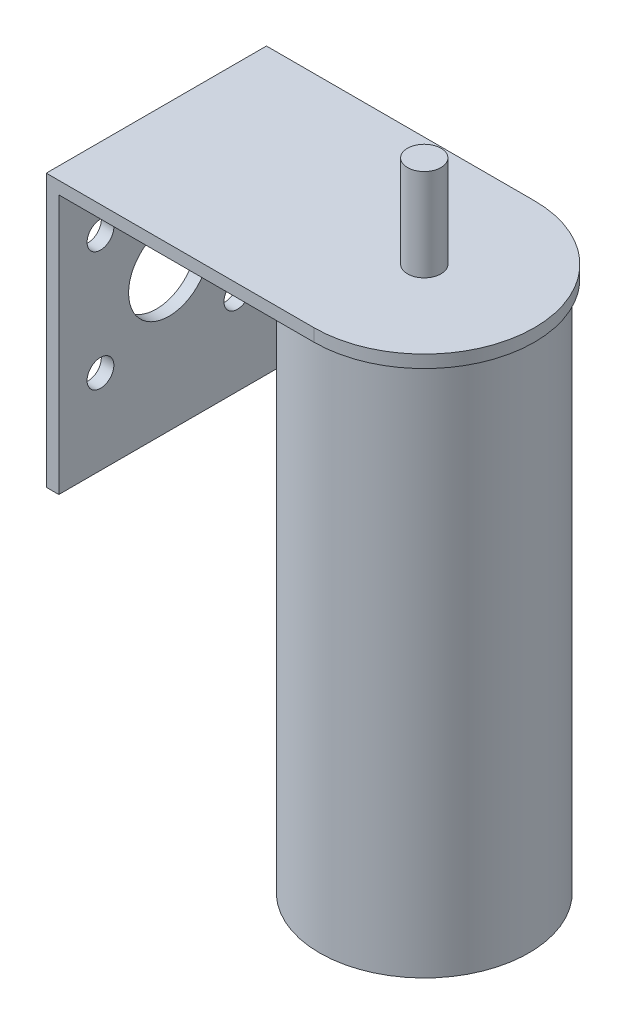
ISO-10303-21;
HEADER;
FILE_DESCRIPTION(('STEP AP214'),'2;1');
FILE_NAME('part.step','',(''),(''),'','','');
FILE_SCHEMA(('AUTOMOTIVE_DESIGN { 1 0 10303 214 1 1 1 1 }'));
ENDSEC;
DATA;
#1=APPLICATION_CONTEXT('core data for automotive mechanical design processes');
#2=APPLICATION_PROTOCOL_DEFINITION('international standard','automotive_design',2000,#1);
#3=PRODUCT_CONTEXT('',#1,'mechanical');
#4=PRODUCT('Part','Part','',(#3));
#5=PRODUCT_RELATED_PRODUCT_CATEGORY('part','',(#4));
#6=PRODUCT_DEFINITION_FORMATION('','',#4);
#7=PRODUCT_DEFINITION_CONTEXT('part definition',#1,'design');
#8=PRODUCT_DEFINITION('design','',#6,#7);
#9=PRODUCT_DEFINITION_SHAPE('','',#8);
#10=(LENGTH_UNIT() NAMED_UNIT(*) SI_UNIT(.MILLI.,.METRE.));
#11=(NAMED_UNIT(*) PLANE_ANGLE_UNIT() SI_UNIT($,.RADIAN.));
#12=(NAMED_UNIT(*) SI_UNIT($,.STERADIAN.) SOLID_ANGLE_UNIT());
#13=UNCERTAINTY_MEASURE_WITH_UNIT(LENGTH_MEASURE(1.E-05),#10,'distance_accuracy_value','');
#14=(GEOMETRIC_REPRESENTATION_CONTEXT(3) GLOBAL_UNCERTAINTY_ASSIGNED_CONTEXT((#13)) GLOBAL_UNIT_ASSIGNED_CONTEXT((#10,
#11,#12)) REPRESENTATION_CONTEXT('',''));
#15=CARTESIAN_POINT('',(0.,0.,0.));
#16=DIRECTION('',(0.,0.,1.));
#17=DIRECTION('',(1.,0.,0.));
#18=AXIS2_PLACEMENT_3D('',#15,#16,#17);
#19=CARTESIAN_POINT('',(0.,63.5,0.));
#20=DIRECTION('',(0.,-1.,0.));
#21=DIRECTION('',(0.,0.,-1.));
#22=AXIS2_PLACEMENT_3D('',#19,#20,#21);
#23=PLANE('',#22);
#24=CARTESIAN_POINT('',(0.,63.5,0.));
#25=DIRECTION('',(0.,-1.,0.));
#26=DIRECTION('',(0.,0.,-1.));
#27=AXIS2_PLACEMENT_3D('',#24,#25,#26);
#28=CIRCLE('',#27,12.5);
#29=CARTESIAN_POINT('',(0.,63.5,-12.5));
#30=VERTEX_POINT('',#29);
#31=EDGE_CURVE('E101',#30,#30,#28,.T.);
#32=ORIENTED_EDGE('',*,*,#31,.F.);
#33=EDGE_LOOP('',(#32));
#34=FACE_BOUND('',#33,.T.);
#35=DIRECTION('',(1.,0.,0.));
#36=VECTOR('',#35,1.);
#37=CARTESIAN_POINT('',(-32.,63.5,13.15));
#38=LINE('',#37,#36);
#39=CARTESIAN_POINT('',(-30.5,63.5,13.15));
#40=VERTEX_POINT('',#39);
#41=CARTESIAN_POINT('',(0.,63.5,13.15));
#42=VERTEX_POINT('',#41);
#43=EDGE_CURVE('E118',#40,#42,#38,.T.);
#44=ORIENTED_EDGE('',*,*,#43,.F.);
#45=DIRECTION('',(0.,0.,1.));
#46=VECTOR('',#45,1.);
#47=CARTESIAN_POINT('',(-30.5,63.5,13.15));
#48=LINE('',#47,#46);
#49=CARTESIAN_POINT('',(-30.5,63.5,-13.15));
#50=VERTEX_POINT('',#49);
#51=EDGE_CURVE('E151',#50,#40,#48,.T.);
#52=ORIENTED_EDGE('',*,*,#51,.F.);
#53=DIRECTION('',(-1.,0.,0.));
#54=VECTOR('',#53,1.);
#55=CARTESIAN_POINT('',(0.,63.5,-13.15));
#56=LINE('',#55,#54);
#57=CARTESIAN_POINT('',(0.,63.5,-13.15));
#58=VERTEX_POINT('',#57);
#59=EDGE_CURVE('E129',#58,#50,#56,.T.);
#60=ORIENTED_EDGE('',*,*,#59,.F.);
#61=CARTESIAN_POINT('',(0.,63.5,0.));
#62=DIRECTION('',(0.,-1.,0.));
#63=DIRECTION('',(0.,0.,-1.));
#64=AXIS2_PLACEMENT_3D('',#61,#62,#63);
#65=CIRCLE('',#64,13.15);
#66=EDGE_CURVE('E120',#58,#42,#65,.T.);
#67=ORIENTED_EDGE('',*,*,#66,.T.);
#68=EDGE_LOOP('',(#44,#52,#60,#67));
#69=FACE_BOUND('',#68,.T.);
#70=ADVANCED_FACE('F46',(#34,#69),#23,.T.);
#71=CARTESIAN_POINT('',(0.,65.,0.));
#72=DIRECTION('',(0.,1.,0.));
#73=DIRECTION('',(0.,0.,1.));
#74=AXIS2_PLACEMENT_3D('',#71,#72,#73);
#75=PLANE('',#74);
#76=CARTESIAN_POINT('',(0.,65.,0.));
#77=DIRECTION('',(0.,1.,0.));
#78=DIRECTION('',(0.,0.,1.));
#79=AXIS2_PLACEMENT_3D('',#76,#77,#78);
#80=CIRCLE('',#79,2.);
#81=CARTESIAN_POINT('',(0.,65.,2.));
#82=VERTEX_POINT('',#81);
#83=EDGE_CURVE('E13',#82,#82,#80,.T.);
#84=ORIENTED_EDGE('',*,*,#83,.F.);
#85=EDGE_LOOP('',(#84));
#86=FACE_BOUND('',#85,.T.);
#87=DIRECTION('',(0.,0.,1.));
#88=VECTOR('',#87,1.);
#89=CARTESIAN_POINT('',(-32.,65.,-13.15));
#90=LINE('',#89,#88);
#91=CARTESIAN_POINT('',(-32.,65.,-13.15));
#92=VERTEX_POINT('',#91);
#93=CARTESIAN_POINT('',(-32.,65.,13.15));
#94=VERTEX_POINT('',#93);
#95=EDGE_CURVE('E104',#92,#94,#90,.T.);
#96=ORIENTED_EDGE('',*,*,#95,.T.);
#97=DIRECTION('',(1.,0.,0.));
#98=VECTOR('',#97,1.);
#99=CARTESIAN_POINT('',(-32.,65.,13.15));
#100=LINE('',#99,#98);
#101=CARTESIAN_POINT('',(0.,65.,13.15));
#102=VERTEX_POINT('',#101);
#103=EDGE_CURVE('E111',#94,#102,#100,.T.);
#104=ORIENTED_EDGE('',*,*,#103,.T.);
#105=CARTESIAN_POINT('',(0.,65.,0.));
#106=DIRECTION('',(0.,-1.,0.));
#107=DIRECTION('',(0.,0.,-1.));
#108=AXIS2_PLACEMENT_3D('',#105,#106,#107);
#109=CIRCLE('',#108,13.15);
#110=CARTESIAN_POINT('',(0.,65.,-13.15));
#111=VERTEX_POINT('',#110);
#112=EDGE_CURVE('E117',#111,#102,#109,.T.);
#113=ORIENTED_EDGE('',*,*,#112,.F.);
#114=DIRECTION('',(-1.,0.,0.));
#115=VECTOR('',#114,1.);
#116=CARTESIAN_POINT('',(0.,65.,-13.15));
#117=LINE('',#116,#115);
#118=EDGE_CURVE('E93',#111,#92,#117,.T.);
#119=ORIENTED_EDGE('',*,*,#118,.T.);
#120=EDGE_LOOP('',(#96,#104,#113,#119));
#121=FACE_BOUND('',#120,.T.);
#122=ADVANCED_FACE('F115',(#86,#121),#75,.T.);
#123=CARTESIAN_POINT('',(0.,76.,0.));
#124=DIRECTION('',(0.,-1.,0.));
#125=DIRECTION('',(0.,0.,-1.));
#126=AXIS2_PLACEMENT_3D('',#123,#124,#125);
#127=CYLINDRICAL_SURFACE('',#126,2.);
#128=CARTESIAN_POINT('',(0.,76.,0.));
#129=DIRECTION('',(0.,1.,0.));
#130=DIRECTION('',(0.,0.,1.));
#131=AXIS2_PLACEMENT_3D('',#128,#129,#130);
#132=CIRCLE('',#131,2.);
#133=CARTESIAN_POINT('',(0.,76.,2.));
#134=VERTEX_POINT('',#133);
#135=EDGE_CURVE('E130',#134,#134,#132,.T.);
#136=ORIENTED_EDGE('',*,*,#135,.F.);
#137=EDGE_LOOP('',(#136));
#138=FACE_BOUND('',#137,.T.);
#139=ORIENTED_EDGE('',*,*,#83,.T.);
#140=EDGE_LOOP('',(#139));
#141=FACE_BOUND('',#140,.T.);
#142=ADVANCED_FACE('F238',(#138,#141),#127,.T.);
#143=CARTESIAN_POINT('',(0.,76.,0.));
#144=DIRECTION('',(0.,1.,0.));
#145=DIRECTION('',(0.,0.,1.));
#146=AXIS2_PLACEMENT_3D('',#143,#144,#145);
#147=PLANE('',#146);
#148=ORIENTED_EDGE('',*,*,#135,.T.);
#149=EDGE_LOOP('',(#148));
#150=FACE_BOUND('',#149,.T.);
#151=ADVANCED_FACE('F210',(#150),#147,.T.);
#152=CARTESIAN_POINT('',(-32.,63.5,-13.15));
#153=DIRECTION('',(-1.,0.,0.));
#154=DIRECTION('',(0.,0.,1.));
#155=AXIS2_PLACEMENT_3D('',#152,#153,#154);
#156=PLANE('',#155);
#157=CARTESIAN_POINT('',(-32.,42.6,-8.17499999999999));
#158=DIRECTION('',(-1.,0.,0.));
#159=DIRECTION('',(0.,0.,1.));
#160=AXIS2_PLACEMENT_3D('',#157,#158,#159);
#161=CIRCLE('',#160,1.59999999999999);
#162=CARTESIAN_POINT('',(-32.,42.6,-6.575));
#163=VERTEX_POINT('',#162);
#164=EDGE_CURVE('E193',#163,#163,#161,.T.);
#165=ORIENTED_EDGE('',*,*,#164,.F.);
#166=EDGE_LOOP('',(#165));
#167=FACE_BOUND('',#166,.T.);
#168=CARTESIAN_POINT('',(-32.,42.6,8.175));
#169=DIRECTION('',(-1.,0.,0.));
#170=DIRECTION('',(0.,0.,1.));
#171=AXIS2_PLACEMENT_3D('',#168,#169,#170);
#172=CIRCLE('',#171,1.6);
#173=CARTESIAN_POINT('',(-32.,42.6,9.775));
#174=VERTEX_POINT('',#173);
#175=EDGE_CURVE('E196',#174,#174,#172,.T.);
#176=ORIENTED_EDGE('',*,*,#175,.F.);
#177=EDGE_LOOP('',(#176));
#178=FACE_BOUND('',#177,.T.);
#179=CARTESIAN_POINT('',(-32.,56.9,8.17500000000001));
#180=DIRECTION('',(-1.,0.,0.));
#181=DIRECTION('',(0.,0.,1.));
#182=AXIS2_PLACEMENT_3D('',#179,#180,#181);
#183=CIRCLE('',#182,1.6);
#184=CARTESIAN_POINT('',(-32.,56.9,9.775));
#185=VERTEX_POINT('',#184);
#186=EDGE_CURVE('E199',#185,#185,#183,.T.);
#187=ORIENTED_EDGE('',*,*,#186,.F.);
#188=EDGE_LOOP('',(#187));
#189=FACE_BOUND('',#188,.T.);
#190=CARTESIAN_POINT('',(-32.,56.9,-8.175));
#191=DIRECTION('',(-1.,0.,0.));
#192=DIRECTION('',(0.,0.,1.));
#193=AXIS2_PLACEMENT_3D('',#190,#191,#192);
#194=CIRCLE('',#193,1.59999999999999);
#195=CARTESIAN_POINT('',(-32.,56.9,-6.575));
#196=VERTEX_POINT('',#195);
#197=EDGE_CURVE('E192',#196,#196,#194,.T.);
#198=ORIENTED_EDGE('',*,*,#197,.F.);
#199=EDGE_LOOP('',(#198));
#200=FACE_BOUND('',#199,.T.);
#201=CARTESIAN_POINT('',(-32.,49.1813140413089,0.));
#202=DIRECTION('',(-1.,0.,0.));
#203=DIRECTION('',(0.,0.,1.));
#204=AXIS2_PLACEMENT_3D('',#201,#202,#203);
#205=CIRCLE('',#204,4.81868595869109);
#206=CARTESIAN_POINT('',(-32.,49.1813140413089,4.8186859586911));
#207=VERTEX_POINT('',#206);
#208=EDGE_CURVE('E141',#207,#207,#205,.T.);
#209=ORIENTED_EDGE('',*,*,#208,.F.);
#210=EDGE_LOOP('',(#209));
#211=FACE_BOUND('',#210,.T.);
#212=ORIENTED_EDGE('',*,*,#95,.F.);
#213=DIRECTION('',(0.,1.,0.));
#214=VECTOR('',#213,1.);
#215=CARTESIAN_POINT('',(-32.,63.5,-13.15));
#216=LINE('',#215,#214);
#217=CARTESIAN_POINT('',(-32.,32.5,-13.15));
#218=VERTEX_POINT('',#217);
#219=EDGE_CURVE('E89',#218,#92,#216,.T.);
#220=ORIENTED_EDGE('',*,*,#219,.F.);
#221=DIRECTION('',(0.,0.,-1.));
#222=VECTOR('',#221,1.);
#223=CARTESIAN_POINT('',(-32.,32.5,13.15));
#224=LINE('',#223,#222);
#225=CARTESIAN_POINT('',(-32.,32.5,13.15));
#226=VERTEX_POINT('',#225);
#227=EDGE_CURVE('E154',#226,#218,#224,.T.);
#228=ORIENTED_EDGE('',*,*,#227,.F.);
#229=DIRECTION('',(0.,1.,0.));
#230=VECTOR('',#229,1.);
#231=CARTESIAN_POINT('',(-32.,63.5,13.15));
#232=LINE('',#231,#230);
#233=EDGE_CURVE('E107',#226,#94,#232,.T.);
#234=ORIENTED_EDGE('',*,*,#233,.T.);
#235=EDGE_LOOP('',(#212,#220,#228,#234));
#236=FACE_BOUND('',#235,.T.);
#237=ADVANCED_FACE('F105',(#167,#178,#189,#200,#211,#236),#156,.T.);
#238=CARTESIAN_POINT('',(0.,63.5,-13.15));
#239=DIRECTION('',(0.,0.,-1.));
#240=DIRECTION('',(-1.,0.,0.));
#241=AXIS2_PLACEMENT_3D('',#238,#239,#240);
#242=PLANE('',#241);
#243=ORIENTED_EDGE('',*,*,#118,.F.);
#244=DIRECTION('',(0.,1.,0.));
#245=VECTOR('',#244,1.);
#246=CARTESIAN_POINT('',(0.,63.5,-13.15));
#247=LINE('',#246,#245);
#248=EDGE_CURVE('E72',#58,#111,#247,.T.);
#249=ORIENTED_EDGE('',*,*,#248,.F.);
#250=ORIENTED_EDGE('',*,*,#59,.T.);
#251=DIRECTION('',(0.,1.,0.));
#252=VECTOR('',#251,1.);
#253=CARTESIAN_POINT('',(-30.5,32.5,-13.15));
#254=LINE('',#253,#252);
#255=CARTESIAN_POINT('',(-30.5,32.5,-13.15));
#256=VERTEX_POINT('',#255);
#257=EDGE_CURVE('E112',#256,#50,#254,.T.);
#258=ORIENTED_EDGE('',*,*,#257,.F.);
#259=DIRECTION('',(1.,0.,0.));
#260=VECTOR('',#259,1.);
#261=CARTESIAN_POINT('',(-32.,32.5,-13.15));
#262=LINE('',#261,#260);
#263=EDGE_CURVE('E97',#218,#256,#262,.T.);
#264=ORIENTED_EDGE('',*,*,#263,.F.);
#265=ORIENTED_EDGE('',*,*,#219,.T.);
#266=EDGE_LOOP('',(#243,#249,#250,#258,#264,#265));
#267=FACE_BOUND('',#266,.T.);
#268=ADVANCED_FACE('F91',(#267),#242,.T.);
#269=CARTESIAN_POINT('',(0.,63.5,0.));
#270=DIRECTION('',(0.,1.,0.));
#271=DIRECTION('',(0.,0.,1.));
#272=AXIS2_PLACEMENT_3D('',#269,#270,#271);
#273=CYLINDRICAL_SURFACE('',#272,13.15);
#274=ORIENTED_EDGE('',*,*,#112,.T.);
#275=DIRECTION('',(0.,1.,0.));
#276=VECTOR('',#275,1.);
#277=CARTESIAN_POINT('',(0.,63.5,13.15));
#278=LINE('',#277,#276);
#279=EDGE_CURVE('E126',#42,#102,#278,.T.);
#280=ORIENTED_EDGE('',*,*,#279,.F.);
#281=ORIENTED_EDGE('',*,*,#66,.F.);
#282=ORIENTED_EDGE('',*,*,#248,.T.);
#283=EDGE_LOOP('',(#274,#280,#281,#282));
#284=FACE_BOUND('',#283,.T.);
#285=ADVANCED_FACE('F173',(#284),#273,.T.);
#286=CARTESIAN_POINT('',(-32.,63.5,13.15));
#287=DIRECTION('',(0.,0.,1.));
#288=DIRECTION('',(1.,0.,0.));
#289=AXIS2_PLACEMENT_3D('',#286,#287,#288);
#290=PLANE('',#289);
#291=ORIENTED_EDGE('',*,*,#103,.F.);
#292=ORIENTED_EDGE('',*,*,#233,.F.);
#293=DIRECTION('',(-1.,0.,0.));
#294=VECTOR('',#293,1.);
#295=CARTESIAN_POINT('',(-32.,32.5,13.15));
#296=LINE('',#295,#294);
#297=CARTESIAN_POINT('',(-30.5,32.5,13.15));
#298=VERTEX_POINT('',#297);
#299=EDGE_CURVE('E163',#298,#226,#296,.T.);
#300=ORIENTED_EDGE('',*,*,#299,.F.);
#301=DIRECTION('',(0.,1.,0.));
#302=VECTOR('',#301,1.);
#303=CARTESIAN_POINT('',(-30.5,32.5,13.15));
#304=LINE('',#303,#302);
#305=EDGE_CURVE('E63',#298,#40,#304,.T.);
#306=ORIENTED_EDGE('',*,*,#305,.T.);
#307=ORIENTED_EDGE('',*,*,#43,.T.);
#308=ORIENTED_EDGE('',*,*,#279,.T.);
#309=EDGE_LOOP('',(#291,#292,#300,#306,#307,#308));
#310=FACE_BOUND('',#309,.T.);
#311=ADVANCED_FACE('F169',(#310),#290,.T.);
#312=CARTESIAN_POINT('',(0.,0.,0.));
#313=DIRECTION('',(0.,1.,0.));
#314=DIRECTION('',(0.,0.,1.));
#315=AXIS2_PLACEMENT_3D('',#312,#313,#314);
#316=PLANE('',#315);
#317=CARTESIAN_POINT('',(0.,0.,0.));
#318=DIRECTION('',(0.,1.,0.));
#319=DIRECTION('',(0.,0.,1.));
#320=AXIS2_PLACEMENT_3D('',#317,#318,#319);
#321=CIRCLE('',#320,12.5);
#322=CARTESIAN_POINT('',(0.,0.,12.5));
#323=VERTEX_POINT('',#322);
#324=EDGE_CURVE('E55',#323,#323,#321,.T.);
#325=ORIENTED_EDGE('',*,*,#324,.F.);
#326=EDGE_LOOP('',(#325));
#327=FACE_BOUND('',#326,.T.);
#328=ADVANCED_FACE('F230',(#327),#316,.F.);
#329=CARTESIAN_POINT('',(0.,65.,0.));
#330=DIRECTION('',(0.,-1.,0.));
#331=DIRECTION('',(0.,0.,-1.));
#332=AXIS2_PLACEMENT_3D('',#329,#330,#331);
#333=CYLINDRICAL_SURFACE('',#332,12.5);
#334=ORIENTED_EDGE('',*,*,#31,.T.);
#335=EDGE_LOOP('',(#334));
#336=FACE_BOUND('',#335,.T.);
#337=ORIENTED_EDGE('',*,*,#324,.T.);
#338=EDGE_LOOP('',(#337));
#339=FACE_BOUND('',#338,.T.);
#340=ADVANCED_FACE('F48',(#336,#339),#333,.T.);
#341=CARTESIAN_POINT('',(-30.5,32.5,13.15));
#342=DIRECTION('',(-1.,0.,0.));
#343=DIRECTION('',(0.,0.,1.));
#344=AXIS2_PLACEMENT_3D('',#341,#342,#343);
#345=PLANE('',#344);
#346=CARTESIAN_POINT('',(-30.5,42.6,-8.17499999999999));
#347=DIRECTION('',(-1.,0.,0.));
#348=DIRECTION('',(0.,0.,1.));
#349=AXIS2_PLACEMENT_3D('',#346,#347,#348);
#350=CIRCLE('',#349,1.59999999999999);
#351=CARTESIAN_POINT('',(-30.5,42.6,-6.575));
#352=VERTEX_POINT('',#351);
#353=EDGE_CURVE('E50',#352,#352,#350,.T.);
#354=ORIENTED_EDGE('',*,*,#353,.T.);
#355=EDGE_LOOP('',(#354));
#356=FACE_BOUND('',#355,.T.);
#357=CARTESIAN_POINT('',(-30.5,42.6,8.175));
#358=DIRECTION('',(-1.,0.,0.));
#359=DIRECTION('',(0.,0.,1.));
#360=AXIS2_PLACEMENT_3D('',#357,#358,#359);
#361=CIRCLE('',#360,1.6);
#362=CARTESIAN_POINT('',(-30.5,42.6,9.775));
#363=VERTEX_POINT('',#362);
#364=EDGE_CURVE('E146',#363,#363,#361,.T.);
#365=ORIENTED_EDGE('',*,*,#364,.T.);
#366=EDGE_LOOP('',(#365));
#367=FACE_BOUND('',#366,.T.);
#368=CARTESIAN_POINT('',(-30.5,56.9,8.17500000000001));
#369=DIRECTION('',(-1.,0.,0.));
#370=DIRECTION('',(0.,0.,1.));
#371=AXIS2_PLACEMENT_3D('',#368,#369,#370);
#372=CIRCLE('',#371,1.6);
#373=CARTESIAN_POINT('',(-30.5,56.9,9.775));
#374=VERTEX_POINT('',#373);
#375=EDGE_CURVE('E144',#374,#374,#372,.T.);
#376=ORIENTED_EDGE('',*,*,#375,.T.);
#377=EDGE_LOOP('',(#376));
#378=FACE_BOUND('',#377,.T.);
#379=CARTESIAN_POINT('',(-30.5,56.9,-8.175));
#380=DIRECTION('',(-1.,0.,0.));
#381=DIRECTION('',(0.,0.,1.));
#382=AXIS2_PLACEMENT_3D('',#379,#380,#381);
#383=CIRCLE('',#382,1.59999999999999);
#384=CARTESIAN_POINT('',(-30.5,56.9,-6.575));
#385=VERTEX_POINT('',#384);
#386=EDGE_CURVE('E140',#385,#385,#383,.T.);
#387=ORIENTED_EDGE('',*,*,#386,.T.);
#388=EDGE_LOOP('',(#387));
#389=FACE_BOUND('',#388,.T.);
#390=CARTESIAN_POINT('',(-30.5,49.1813140413089,0.));
#391=DIRECTION('',(-1.,0.,0.));
#392=DIRECTION('',(0.,0.,1.));
#393=AXIS2_PLACEMENT_3D('',#390,#391,#392);
#394=CIRCLE('',#393,4.81868595869109);
#395=CARTESIAN_POINT('',(-30.5,49.1813140413089,4.8186859586911));
#396=VERTEX_POINT('',#395);
#397=EDGE_CURVE('E137',#396,#396,#394,.T.);
#398=ORIENTED_EDGE('',*,*,#397,.T.);
#399=EDGE_LOOP('',(#398));
#400=FACE_BOUND('',#399,.T.);
#401=ORIENTED_EDGE('',*,*,#51,.T.);
#402=ORIENTED_EDGE('',*,*,#305,.F.);
#403=DIRECTION('',(0.,0.,1.));
#404=VECTOR('',#403,1.);
#405=CARTESIAN_POINT('',(-30.5,32.5,13.15));
#406=LINE('',#405,#404);
#407=EDGE_CURVE('E187',#256,#298,#406,.T.);
#408=ORIENTED_EDGE('',*,*,#407,.F.);
#409=ORIENTED_EDGE('',*,*,#257,.T.);
#410=EDGE_LOOP('',(#401,#402,#408,#409));
#411=FACE_BOUND('',#410,.T.);
#412=ADVANCED_FACE('F221',(#356,#367,#378,#389,#400,#411),#345,.F.);
#413=CARTESIAN_POINT('',(0.,32.5,0.));
#414=DIRECTION('',(0.,-1.,0.));
#415=DIRECTION('',(0.,0.,-1.));
#416=AXIS2_PLACEMENT_3D('',#413,#414,#415);
#417=PLANE('',#416);
#418=ORIENTED_EDGE('',*,*,#227,.T.);
#419=ORIENTED_EDGE('',*,*,#263,.T.);
#420=ORIENTED_EDGE('',*,*,#407,.T.);
#421=ORIENTED_EDGE('',*,*,#299,.T.);
#422=EDGE_LOOP('',(#418,#419,#420,#421));
#423=FACE_BOUND('',#422,.T.);
#424=ADVANCED_FACE('F186',(#423),#417,.T.);
#425=CARTESIAN_POINT('',(-21.,49.1813140413089,0.));
#426=DIRECTION('',(-1.,0.,0.));
#427=DIRECTION('',(0.,0.,1.));
#428=AXIS2_PLACEMENT_3D('',#425,#426,#427);
#429=CYLINDRICAL_SURFACE('',#428,4.81868595869109);
#430=ORIENTED_EDGE('',*,*,#208,.T.);
#431=EDGE_LOOP('',(#430));
#432=FACE_BOUND('',#431,.T.);
#433=ORIENTED_EDGE('',*,*,#397,.F.);
#434=EDGE_LOOP('',(#433));
#435=FACE_BOUND('',#434,.T.);
#436=ADVANCED_FACE('F215',(#432,#435),#429,.F.);
#437=CARTESIAN_POINT('',(-21.,56.9,-8.175));
#438=DIRECTION('',(-1.,0.,0.));
#439=DIRECTION('',(0.,0.,1.));
#440=AXIS2_PLACEMENT_3D('',#437,#438,#439);
#441=CYLINDRICAL_SURFACE('',#440,1.59999999999999);
#442=ORIENTED_EDGE('',*,*,#197,.T.);
#443=EDGE_LOOP('',(#442));
#444=FACE_BOUND('',#443,.T.);
#445=ORIENTED_EDGE('',*,*,#386,.F.);
#446=EDGE_LOOP('',(#445));
#447=FACE_BOUND('',#446,.T.);
#448=ADVANCED_FACE('F205',(#444,#447),#441,.F.);
#449=CARTESIAN_POINT('',(-21.,56.9,8.17500000000001));
#450=DIRECTION('',(-1.,0.,0.));
#451=DIRECTION('',(0.,0.,1.));
#452=AXIS2_PLACEMENT_3D('',#449,#450,#451);
#453=CYLINDRICAL_SURFACE('',#452,1.6);
#454=ORIENTED_EDGE('',*,*,#186,.T.);
#455=EDGE_LOOP('',(#454));
#456=FACE_BOUND('',#455,.T.);
#457=ORIENTED_EDGE('',*,*,#375,.F.);
#458=EDGE_LOOP('',(#457));
#459=FACE_BOUND('',#458,.T.);
#460=ADVANCED_FACE('F286',(#456,#459),#453,.F.);
#461=CARTESIAN_POINT('',(-21.,42.6,8.175));
#462=DIRECTION('',(-1.,0.,0.));
#463=DIRECTION('',(0.,0.,1.));
#464=AXIS2_PLACEMENT_3D('',#461,#462,#463);
#465=CYLINDRICAL_SURFACE('',#464,1.6);
#466=ORIENTED_EDGE('',*,*,#175,.T.);
#467=EDGE_LOOP('',(#466));
#468=FACE_BOUND('',#467,.T.);
#469=ORIENTED_EDGE('',*,*,#364,.F.);
#470=EDGE_LOOP('',(#469));
#471=FACE_BOUND('',#470,.T.);
#472=ADVANCED_FACE('F293',(#468,#471),#465,.F.);
#473=CARTESIAN_POINT('',(-21.,42.6,-8.17499999999999));
#474=DIRECTION('',(-1.,0.,0.));
#475=DIRECTION('',(0.,0.,1.));
#476=AXIS2_PLACEMENT_3D('',#473,#474,#475);
#477=CYLINDRICAL_SURFACE('',#476,1.59999999999999);
#478=ORIENTED_EDGE('',*,*,#164,.T.);
#479=EDGE_LOOP('',(#478));
#480=FACE_BOUND('',#479,.T.);
#481=ORIENTED_EDGE('',*,*,#353,.F.);
#482=EDGE_LOOP('',(#481));
#483=FACE_BOUND('',#482,.T.);
#484=ADVANCED_FACE('F301',(#480,#483),#477,.F.);
#485=CLOSED_SHELL('',(#70,#122,#142,#151,#237,#268,#285,#311,#328,#340,#412,#424,#436,#448,#460,
#472,#484));
#486=MANIFOLD_SOLID_BREP('B2',#485);
#487=ADVANCED_BREP_SHAPE_REPRESENTATION('',(#18,#486),#14);
#488=SHAPE_DEFINITION_REPRESENTATION(#9,#487);
ENDSEC;
END-ISO-10303-21;
